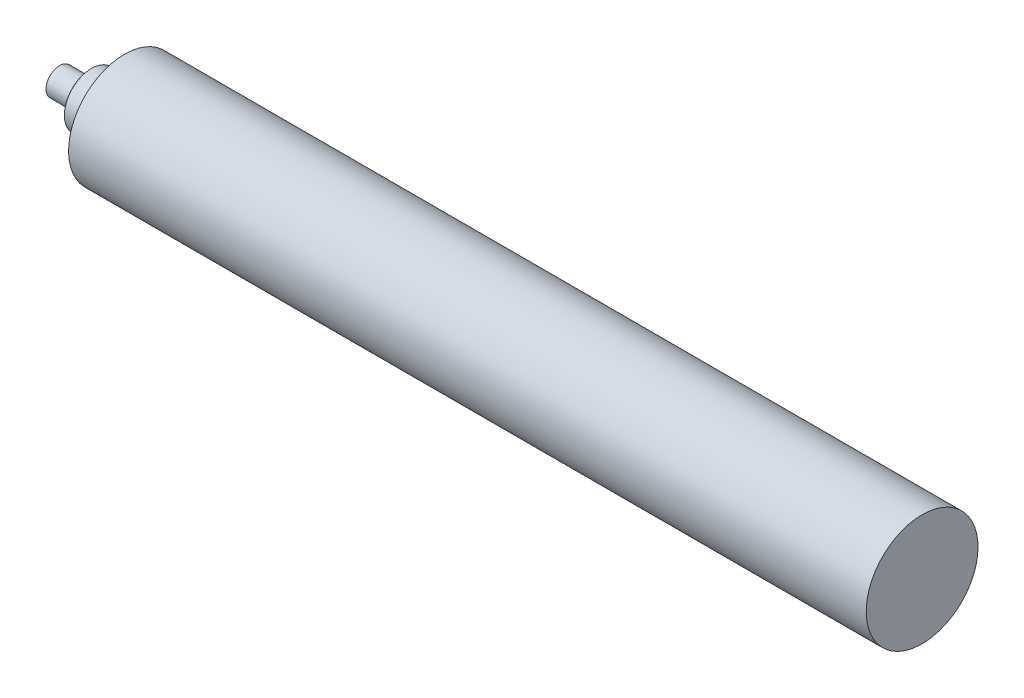
ISO-10303-21;
HEADER;
FILE_DESCRIPTION(('STEP AP214'),'2;1');
FILE_NAME('part.step','',(''),(''),'','','');
FILE_SCHEMA(('AUTOMOTIVE_DESIGN { 1 0 10303 214 1 1 1 1 }'));
ENDSEC;
DATA;
#1=APPLICATION_CONTEXT('core data for automotive mechanical design processes');
#2=APPLICATION_PROTOCOL_DEFINITION('international standard','automotive_design',2000,#1);
#3=PRODUCT_CONTEXT('',#1,'mechanical');
#4=PRODUCT('Part','Part','',(#3));
#5=PRODUCT_RELATED_PRODUCT_CATEGORY('part','',(#4));
#6=PRODUCT_DEFINITION_FORMATION('','',#4);
#7=PRODUCT_DEFINITION_CONTEXT('part definition',#1,'design');
#8=PRODUCT_DEFINITION('design','',#6,#7);
#9=PRODUCT_DEFINITION_SHAPE('','',#8);
#10=(LENGTH_UNIT() NAMED_UNIT(*) SI_UNIT(.MILLI.,.METRE.));
#11=(NAMED_UNIT(*) PLANE_ANGLE_UNIT() SI_UNIT($,.RADIAN.));
#12=(NAMED_UNIT(*) SI_UNIT($,.STERADIAN.) SOLID_ANGLE_UNIT());
#13=UNCERTAINTY_MEASURE_WITH_UNIT(LENGTH_MEASURE(1.E-05),#10,'distance_accuracy_value','');
#14=(GEOMETRIC_REPRESENTATION_CONTEXT(3) GLOBAL_UNCERTAINTY_ASSIGNED_CONTEXT((#13)) GLOBAL_UNIT_ASSIGNED_CONTEXT((#10,
#11,#12)) REPRESENTATION_CONTEXT('',''));
#15=CARTESIAN_POINT('',(0.,0.,0.));
#16=DIRECTION('',(0.,0.,1.));
#17=DIRECTION('',(1.,0.,0.));
#18=AXIS2_PLACEMENT_3D('',#15,#16,#17);
#19=CARTESIAN_POINT('',(759.206,49.2125,0.));
#20=DIRECTION('',(1.,0.,0.));
#21=DIRECTION('',(0.,1.,0.));
#22=AXIS2_PLACEMENT_3D('',#19,#20,#21);
#23=PLANE('',#22);
#24=CARTESIAN_POINT('',(759.206,0.,0.));
#25=DIRECTION('',(1.,0.,0.));
#26=DIRECTION('',(0.,1.,0.));
#27=AXIS2_PLACEMENT_3D('',#24,#25,#26);
#28=CIRCLE('',#27,49.2125);
#29=CARTESIAN_POINT('',(759.206,49.2125,0.));
#30=VERTEX_POINT('',#29);
#31=EDGE_CURVE('E11',#30,#30,#28,.T.);
#32=ORIENTED_EDGE('',*,*,#31,.T.);
#33=EDGE_LOOP('',(#32));
#34=FACE_BOUND('',#33,.T.);
#35=ADVANCED_FACE('F35',(#34),#23,.T.);
#36=CARTESIAN_POINT('',(759.206,0.,0.));
#37=DIRECTION('',(1.,0.,0.));
#38=DIRECTION('',(0.,1.,0.));
#39=AXIS2_PLACEMENT_3D('',#36,#37,#38);
#40=CYLINDRICAL_SURFACE('',#39,49.2125);
#41=CARTESIAN_POINT('',(57.15,0.,0.));
#42=DIRECTION('',(1.,0.,0.));
#43=DIRECTION('',(0.,1.,0.));
#44=AXIS2_PLACEMENT_3D('',#41,#42,#43);
#45=CIRCLE('',#44,49.2125);
#46=CARTESIAN_POINT('',(57.15,49.2125,0.));
#47=VERTEX_POINT('',#46);
#48=EDGE_CURVE('E41',#47,#47,#45,.T.);
#49=ORIENTED_EDGE('',*,*,#48,.T.);
#50=EDGE_LOOP('',(#49));
#51=FACE_BOUND('',#50,.T.);
#52=ORIENTED_EDGE('',*,*,#31,.F.);
#53=EDGE_LOOP('',(#52));
#54=FACE_BOUND('',#53,.T.);
#55=ADVANCED_FACE('F57',(#51,#54),#40,.T.);
#56=CARTESIAN_POINT('',(57.15,23.876,0.));
#57=DIRECTION('',(-1.,0.,0.));
#58=DIRECTION('',(0.,-1.,0.));
#59=AXIS2_PLACEMENT_3D('',#56,#57,#58);
#60=PLANE('',#59);
#61=CARTESIAN_POINT('',(57.15,0.,0.));
#62=DIRECTION('',(1.,0.,0.));
#63=DIRECTION('',(0.,1.,0.));
#64=AXIS2_PLACEMENT_3D('',#61,#62,#63);
#65=CIRCLE('',#64,23.876);
#66=CARTESIAN_POINT('',(57.15,23.876,0.));
#67=VERTEX_POINT('',#66);
#68=EDGE_CURVE('E142',#67,#67,#65,.T.);
#69=ORIENTED_EDGE('',*,*,#68,.T.);
#70=EDGE_LOOP('',(#69));
#71=FACE_BOUND('',#70,.T.);
#72=ORIENTED_EDGE('',*,*,#48,.F.);
#73=EDGE_LOOP('',(#72));
#74=FACE_BOUND('',#73,.T.);
#75=ADVANCED_FACE('F62',(#71,#74),#60,.T.);
#76=CARTESIAN_POINT('',(759.206,0.,0.));
#77=DIRECTION('',(1.,0.,0.));
#78=DIRECTION('',(0.,1.,0.));
#79=AXIS2_PLACEMENT_3D('',#76,#77,#78);
#80=CYLINDRICAL_SURFACE('',#79,23.876);
#81=CARTESIAN_POINT('',(28.1044065311286,0.,0.));
#82=DIRECTION('',(1.,0.,0.));
#83=DIRECTION('',(0.,1.,0.));
#84=AXIS2_PLACEMENT_3D('',#81,#82,#83);
#85=CIRCLE('',#84,23.876);
#86=CARTESIAN_POINT('',(28.1044065311286,23.876,0.));
#87=VERTEX_POINT('',#86);
#88=EDGE_CURVE('E139',#87,#87,#85,.T.);
#89=ORIENTED_EDGE('',*,*,#88,.T.);
#90=EDGE_LOOP('',(#89));
#91=FACE_BOUND('',#90,.T.);
#92=ORIENTED_EDGE('',*,*,#68,.F.);
#93=EDGE_LOOP('',(#92));
#94=FACE_BOUND('',#93,.T.);
#95=ADVANCED_FACE('F69',(#91,#94),#80,.T.);
#96=CARTESIAN_POINT('',(28.1044065311286,0.,0.));
#97=DIRECTION('',(1.,0.,0.));
#98=DIRECTION('',(0.,1.,0.));
#99=AXIS2_PLACEMENT_3D('',#96,#97,#98);
#100=CONICAL_SURFACE('',#99,23.876,0.867608495422664);
#101=CARTESIAN_POINT('',(27.305,0.,0.));
#102=DIRECTION('',(1.,0.,0.));
#103=DIRECTION('',(0.,1.,0.));
#104=AXIS2_PLACEMENT_3D('',#101,#102,#103);
#105=CIRCLE('',#104,22.9330284091227);
#106=CARTESIAN_POINT('',(27.305,22.9330284091227,0.));
#107=VERTEX_POINT('',#106);
#108=EDGE_CURVE('E136',#107,#107,#105,.T.);
#109=ORIENTED_EDGE('',*,*,#108,.T.);
#110=EDGE_LOOP('',(#109));
#111=FACE_BOUND('',#110,.T.);
#112=ORIENTED_EDGE('',*,*,#88,.F.);
#113=EDGE_LOOP('',(#112));
#114=FACE_BOUND('',#113,.T.);
#115=ADVANCED_FACE('F76',(#111,#114),#100,.T.);
#116=CARTESIAN_POINT('',(27.305,14.478,0.));
#117=DIRECTION('',(-1.,0.,0.));
#118=DIRECTION('',(0.,-1.,0.));
#119=AXIS2_PLACEMENT_3D('',#116,#117,#118);
#120=PLANE('',#119);
#121=CARTESIAN_POINT('',(27.305,0.,0.));
#122=DIRECTION('',(1.,0.,0.));
#123=DIRECTION('',(0.,1.,0.));
#124=AXIS2_PLACEMENT_3D('',#121,#122,#123);
#125=CIRCLE('',#124,14.478);
#126=CARTESIAN_POINT('',(27.305,14.478,0.));
#127=VERTEX_POINT('',#126);
#128=EDGE_CURVE('E133',#127,#127,#125,.T.);
#129=ORIENTED_EDGE('',*,*,#128,.T.);
#130=EDGE_LOOP('',(#129));
#131=FACE_BOUND('',#130,.T.);
#132=ORIENTED_EDGE('',*,*,#108,.F.);
#133=EDGE_LOOP('',(#132));
#134=FACE_BOUND('',#133,.T.);
#135=ADVANCED_FACE('F80',(#131,#134),#120,.T.);
#136=CARTESIAN_POINT('',(24.765,0.,0.));
#137=DIRECTION('',(1.,0.,0.));
#138=DIRECTION('',(0.,1.,0.));
#139=AXIS2_PLACEMENT_3D('',#136,#137,#138);
#140=TOROIDAL_SURFACE('',#139,14.478,2.54);
#141=CARTESIAN_POINT('',(24.7649999999999,0.,0.));
#142=DIRECTION('',(1.,0.,0.));
#143=DIRECTION('',(0.,1.,0.));
#144=AXIS2_PLACEMENT_3D('',#141,#142,#143);
#145=CIRCLE('',#144,11.938);
#146=CARTESIAN_POINT('',(24.7649999999999,11.938,0.));
#147=VERTEX_POINT('',#146);
#148=EDGE_CURVE('E130',#147,#147,#145,.T.);
#149=ORIENTED_EDGE('',*,*,#148,.T.);
#150=EDGE_LOOP('',(#149));
#151=FACE_BOUND('',#150,.T.);
#152=ORIENTED_EDGE('',*,*,#128,.F.);
#153=EDGE_LOOP('',(#152));
#154=FACE_BOUND('',#153,.T.);
#155=ADVANCED_FACE('F84',(#151,#154),#140,.F.);
#156=CARTESIAN_POINT('',(759.206,0.,0.));
#157=DIRECTION('',(1.,0.,0.));
#158=DIRECTION('',(0.,1.,0.));
#159=AXIS2_PLACEMENT_3D('',#156,#157,#158);
#160=CYLINDRICAL_SURFACE('',#159,11.938);
#161=CARTESIAN_POINT('',(0.,0.,0.));
#162=DIRECTION('',(1.,0.,0.));
#163=DIRECTION('',(0.,1.,0.));
#164=AXIS2_PLACEMENT_3D('',#161,#162,#163);
#165=CIRCLE('',#164,11.938);
#166=CARTESIAN_POINT('',(0.,11.938,0.));
#167=VERTEX_POINT('',#166);
#168=EDGE_CURVE('E127',#167,#167,#165,.T.);
#169=ORIENTED_EDGE('',*,*,#168,.T.);
#170=EDGE_LOOP('',(#169));
#171=FACE_BOUND('',#170,.T.);
#172=ORIENTED_EDGE('',*,*,#148,.F.);
#173=EDGE_LOOP('',(#172));
#174=FACE_BOUND('',#173,.T.);
#175=ADVANCED_FACE('F88',(#171,#174),#160,.T.);
#176=CARTESIAN_POINT('',(0.,0.,0.));
#177=DIRECTION('',(-1.,0.,0.));
#178=DIRECTION('',(0.,-1.,0.));
#179=AXIS2_PLACEMENT_3D('',#176,#177,#178);
#180=PLANE('',#179);
#181=CARTESIAN_POINT('',(0.,0.,0.));
#182=DIRECTION('',(1.,0.,0.));
#183=DIRECTION('',(0.,0.,-1.));
#184=AXIS2_PLACEMENT_3D('',#181,#182,#183);
#185=CIRCLE('',#184,8.35025);
#186=CARTESIAN_POINT('',(0.,0.,-8.35025));
#187=VERTEX_POINT('',#186);
#188=EDGE_CURVE('E119',#187,#187,#185,.T.);
#189=ORIENTED_EDGE('',*,*,#188,.T.);
#190=EDGE_LOOP('',(#189));
#191=FACE_BOUND('',#190,.T.);
#192=ORIENTED_EDGE('',*,*,#168,.F.);
#193=EDGE_LOOP('',(#192));
#194=FACE_BOUND('',#193,.T.);
#195=ADVANCED_FACE('F92',(#191,#194),#180,.T.);
#196=CARTESIAN_POINT('',(1.905,0.,0.));
#197=DIRECTION('',(-1.,0.,0.));
#198=DIRECTION('',(0.,0.,1.));
#199=AXIS2_PLACEMENT_3D('',#196,#197,#198);
#200=CONICAL_SURFACE('',#199,6.556375,0.755364278732698);
#201=ORIENTED_EDGE('',*,*,#188,.F.);
#202=EDGE_LOOP('',(#201));
#203=FACE_BOUND('',#202,.T.);
#204=CARTESIAN_POINT('',(1.905,0.,0.));
#205=DIRECTION('',(1.,0.,0.));
#206=DIRECTION('',(0.,0.,-1.));
#207=AXIS2_PLACEMENT_3D('',#204,#205,#206);
#208=CIRCLE('',#207,6.556375);
#209=CARTESIAN_POINT('',(1.905,0.,-6.556375));
#210=VERTEX_POINT('',#209);
#211=EDGE_CURVE('E116',#210,#210,#208,.T.);
#212=ORIENTED_EDGE('',*,*,#211,.T.);
#213=EDGE_LOOP('',(#212));
#214=FACE_BOUND('',#213,.T.);
#215=ADVANCED_FACE('F96',(#203,#214),#200,.F.);
#216=CARTESIAN_POINT('',(1.905,0.,-6.556375));
#217=DIRECTION('',(1.,0.,0.));
#218=DIRECTION('',(0.,0.,-1.));
#219=AXIS2_PLACEMENT_3D('',#216,#217,#218);
#220=PLANE('',#219);
#221=CARTESIAN_POINT('',(1.905,0.,0.));
#222=DIRECTION('',(-1.,0.,0.));
#223=DIRECTION('',(0.,0.,1.));
#224=AXIS2_PLACEMENT_3D('',#221,#222,#223);
#225=CIRCLE('',#224,4.);
#226=CARTESIAN_POINT('',(1.905,0.,4.));
#227=VERTEX_POINT('',#226);
#228=EDGE_CURVE('E115',#227,#227,#225,.T.);
#229=ORIENTED_EDGE('',*,*,#228,.F.);
#230=EDGE_LOOP('',(#229));
#231=FACE_BOUND('',#230,.T.);
#232=ORIENTED_EDGE('',*,*,#211,.F.);
#233=EDGE_LOOP('',(#232));
#234=FACE_BOUND('',#233,.T.);
#235=ADVANCED_FACE('F100',(#231,#234),#220,.F.);
#236=CARTESIAN_POINT('',(27.305,0.,0.));
#237=DIRECTION('',(-1.,0.,0.));
#238=DIRECTION('',(0.,0.,1.));
#239=AXIS2_PLACEMENT_3D('',#236,#237,#238);
#240=CYLINDRICAL_SURFACE('',#239,4.);
#241=CARTESIAN_POINT('',(27.305,0.,0.));
#242=DIRECTION('',(-1.,0.,0.));
#243=DIRECTION('',(0.,0.,1.));
#244=AXIS2_PLACEMENT_3D('',#241,#242,#243);
#245=CIRCLE('',#244,4.);
#246=CARTESIAN_POINT('',(27.305,0.,4.));
#247=VERTEX_POINT('',#246);
#248=EDGE_CURVE('E112',#247,#247,#245,.T.);
#249=ORIENTED_EDGE('',*,*,#248,.F.);
#250=EDGE_LOOP('',(#249));
#251=FACE_BOUND('',#250,.T.);
#252=ORIENTED_EDGE('',*,*,#228,.T.);
#253=EDGE_LOOP('',(#252));
#254=FACE_BOUND('',#253,.T.);
#255=ADVANCED_FACE('F52',(#251,#254),#240,.F.);
#256=CARTESIAN_POINT('',(27.305,0.,0.));
#257=DIRECTION('',(1.,0.,0.));
#258=DIRECTION('',(0.,0.,-1.));
#259=AXIS2_PLACEMENT_3D('',#256,#257,#258);
#260=PLANE('',#259);
#261=CARTESIAN_POINT('',(27.305,0.,0.));
#262=DIRECTION('',(-1.,0.,0.));
#263=DIRECTION('',(0.,0.,1.));
#264=AXIS2_PLACEMENT_3D('',#261,#262,#263);
#265=CIRCLE('',#264,6.35105942758608);
#266=CARTESIAN_POINT('',(27.305,0.,6.35105942758608));
#267=VERTEX_POINT('',#266);
#268=EDGE_CURVE('E121',#267,#267,#265,.T.);
#269=ORIENTED_EDGE('',*,*,#268,.F.);
#270=EDGE_LOOP('',(#269));
#271=FACE_BOUND('',#270,.T.);
#272=ORIENTED_EDGE('',*,*,#248,.T.);
#273=EDGE_LOOP('',(#272));
#274=FACE_BOUND('',#273,.T.);
#275=ADVANCED_FACE('F46',(#271,#274),#260,.T.);
#276=CARTESIAN_POINT('',(28.575,0.,0.));
#277=DIRECTION('',(-1.,0.,0.));
#278=DIRECTION('',(0.,0.,1.));
#279=AXIS2_PLACEMENT_3D('',#276,#277,#278);
#280=CONICAL_SURFACE('',#279,0.,1.37343284621992);
#281=ORIENTED_EDGE('',*,*,#268,.T.);
#282=EDGE_LOOP('',(#281));
#283=FACE_BOUND('',#282,.T.);
#284=CARTESIAN_POINT('',(28.575,0.,0.));
#285=VERTEX_POINT('',#284);
#286=VERTEX_LOOP('',#285);
#287=FACE_BOUND('',#286,.T.);
#288=ADVANCED_FACE('F44',(#283,#287),#280,.F.);
#289=CLOSED_SHELL('',(#35,#55,#75,#95,#115,#135,#155,#175,#195,#215,#235,#255,#275,#288));
#290=MANIFOLD_SOLID_BREP('B2',#289);
#291=ADVANCED_BREP_SHAPE_REPRESENTATION('',(#18,#290),#14);
#292=SHAPE_DEFINITION_REPRESENTATION(#9,#291);
ENDSEC;
END-ISO-10303-21;
